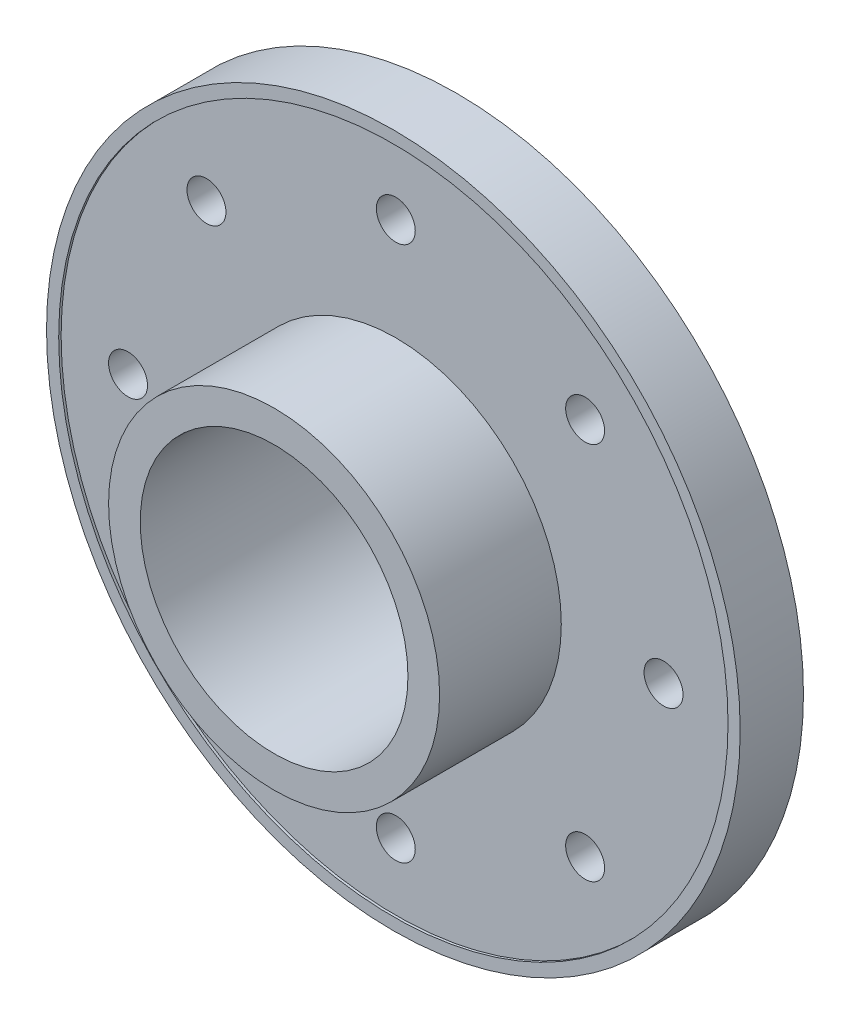
ISO-10303-21;
HEADER;
FILE_DESCRIPTION(('STEP AP214'),'2;1');
FILE_NAME('part.step','',(''),(''),'','','');
FILE_SCHEMA(('AUTOMOTIVE_DESIGN { 1 0 10303 214 1 1 1 1 }'));
ENDSEC;
DATA;
#1=APPLICATION_CONTEXT('core data for automotive mechanical design processes');
#2=APPLICATION_PROTOCOL_DEFINITION('international standard','automotive_design',2000,#1);
#3=PRODUCT_CONTEXT('',#1,'mechanical');
#4=PRODUCT('Part','Part','',(#3));
#5=PRODUCT_RELATED_PRODUCT_CATEGORY('part','',(#4));
#6=PRODUCT_DEFINITION_FORMATION('','',#4);
#7=PRODUCT_DEFINITION_CONTEXT('part definition',#1,'design');
#8=PRODUCT_DEFINITION('design','',#6,#7);
#9=PRODUCT_DEFINITION_SHAPE('','',#8);
#10=(LENGTH_UNIT() NAMED_UNIT(*) SI_UNIT(.MILLI.,.METRE.));
#11=(NAMED_UNIT(*) PLANE_ANGLE_UNIT() SI_UNIT($,.RADIAN.));
#12=(NAMED_UNIT(*) SI_UNIT($,.STERADIAN.) SOLID_ANGLE_UNIT());
#13=UNCERTAINTY_MEASURE_WITH_UNIT(LENGTH_MEASURE(1.E-05),#10,'distance_accuracy_value','');
#14=(GEOMETRIC_REPRESENTATION_CONTEXT(3) GLOBAL_UNCERTAINTY_ASSIGNED_CONTEXT((#13)) GLOBAL_UNIT_ASSIGNED_CONTEXT((#10,
#11,#12)) REPRESENTATION_CONTEXT('',''));
#15=CARTESIAN_POINT('',(0.,0.,0.));
#16=DIRECTION('',(0.,0.,1.));
#17=DIRECTION('',(1.,0.,0.));
#18=AXIS2_PLACEMENT_3D('',#15,#16,#17);
#19=CARTESIAN_POINT('',(0.,0.,3.));
#20=DIRECTION('',(0.,0.,1.));
#21=DIRECTION('',(1.,0.,0.));
#22=AXIS2_PLACEMENT_3D('',#19,#20,#21);
#23=PLANE('',#22);
#24=CARTESIAN_POINT('',(15.556349186104,15.556349186104,3.));
#25=DIRECTION('',(0.,0.,1.));
#26=DIRECTION('',(1.,0.,0.));
#27=AXIS2_PLACEMENT_3D('',#24,#25,#26);
#28=CIRCLE('',#27,1.6);
#29=CARTESIAN_POINT('',(17.156349186104,15.556349186104,3.));
#30=VERTEX_POINT('',#29);
#31=EDGE_CURVE('E265',#30,#30,#28,.F.);
#32=ORIENTED_EDGE('',*,*,#31,.T.);
#33=EDGE_LOOP('',(#32));
#34=FACE_BOUND('',#33,.T.);
#35=CARTESIAN_POINT('',(22.,0.,3.));
#36=DIRECTION('',(0.,0.,1.));
#37=DIRECTION('',(1.,0.,0.));
#38=AXIS2_PLACEMENT_3D('',#35,#36,#37);
#39=CIRCLE('',#38,1.6);
#40=CARTESIAN_POINT('',(23.6,0.,3.));
#41=VERTEX_POINT('',#40);
#42=EDGE_CURVE('E261',#41,#41,#39,.F.);
#43=ORIENTED_EDGE('',*,*,#42,.T.);
#44=EDGE_LOOP('',(#43));
#45=FACE_BOUND('',#44,.T.);
#46=CARTESIAN_POINT('',(15.556349186104,-15.556349186104,3.));
#47=DIRECTION('',(0.,0.,1.));
#48=DIRECTION('',(1.,0.,0.));
#49=AXIS2_PLACEMENT_3D('',#46,#47,#48);
#50=CIRCLE('',#49,1.6);
#51=CARTESIAN_POINT('',(17.156349186104,-15.556349186104,3.));
#52=VERTEX_POINT('',#51);
#53=EDGE_CURVE('E257',#52,#52,#50,.F.);
#54=ORIENTED_EDGE('',*,*,#53,.T.);
#55=EDGE_LOOP('',(#54));
#56=FACE_BOUND('',#55,.T.);
#57=CARTESIAN_POINT('',(0.,-22.,3.));
#58=DIRECTION('',(0.,0.,1.));
#59=DIRECTION('',(1.,0.,0.));
#60=AXIS2_PLACEMENT_3D('',#57,#58,#59);
#61=CIRCLE('',#60,1.6);
#62=CARTESIAN_POINT('',(1.6,-22.,3.));
#63=VERTEX_POINT('',#62);
#64=EDGE_CURVE('E253',#63,#63,#61,.F.);
#65=ORIENTED_EDGE('',*,*,#64,.T.);
#66=EDGE_LOOP('',(#65));
#67=FACE_BOUND('',#66,.T.);
#68=CARTESIAN_POINT('',(-15.556349186104,-15.556349186104,3.));
#69=DIRECTION('',(0.,0.,1.));
#70=DIRECTION('',(1.,0.,0.));
#71=AXIS2_PLACEMENT_3D('',#68,#69,#70);
#72=CIRCLE('',#71,1.6);
#73=CARTESIAN_POINT('',(-13.956349186104,-15.556349186104,3.));
#74=VERTEX_POINT('',#73);
#75=EDGE_CURVE('E249',#74,#74,#72,.F.);
#76=ORIENTED_EDGE('',*,*,#75,.T.);
#77=EDGE_LOOP('',(#76));
#78=FACE_BOUND('',#77,.T.);
#79=CARTESIAN_POINT('',(-22.,0.,3.));
#80=DIRECTION('',(0.,0.,1.));
#81=DIRECTION('',(1.,0.,0.));
#82=AXIS2_PLACEMENT_3D('',#79,#80,#81);
#83=CIRCLE('',#82,1.6);
#84=CARTESIAN_POINT('',(-20.4,0.,3.));
#85=VERTEX_POINT('',#84);
#86=EDGE_CURVE('E245',#85,#85,#83,.F.);
#87=ORIENTED_EDGE('',*,*,#86,.T.);
#88=EDGE_LOOP('',(#87));
#89=FACE_BOUND('',#88,.T.);
#90=CARTESIAN_POINT('',(-15.556349186104,15.556349186104,3.));
#91=DIRECTION('',(0.,0.,1.));
#92=DIRECTION('',(1.,0.,0.));
#93=AXIS2_PLACEMENT_3D('',#90,#91,#92);
#94=CIRCLE('',#93,1.6);
#95=CARTESIAN_POINT('',(-13.956349186104,15.556349186104,3.));
#96=VERTEX_POINT('',#95);
#97=EDGE_CURVE('E213',#96,#96,#94,.F.);
#98=ORIENTED_EDGE('',*,*,#97,.T.);
#99=EDGE_LOOP('',(#98));
#100=FACE_BOUND('',#99,.T.);
#101=CARTESIAN_POINT('',(0.,22.,3.));
#102=DIRECTION('',(0.,0.,1.));
#103=DIRECTION('',(1.,0.,0.));
#104=AXIS2_PLACEMENT_3D('',#101,#102,#103);
#105=CIRCLE('',#104,1.6);
#106=CARTESIAN_POINT('',(1.6,22.,3.));
#107=VERTEX_POINT('',#106);
#108=EDGE_CURVE('E210',#107,#107,#105,.F.);
#109=ORIENTED_EDGE('',*,*,#108,.T.);
#110=EDGE_LOOP('',(#109));
#111=FACE_BOUND('',#110,.T.);
#112=CARTESIAN_POINT('',(0.,0.,3.));
#113=DIRECTION('',(0.,0.,1.));
#114=DIRECTION('',(1.,0.,0.));
#115=AXIS2_PLACEMENT_3D('',#112,#113,#114);
#116=CIRCLE('',#115,13.6);
#117=CARTESIAN_POINT('',(13.6,0.,3.));
#118=VERTEX_POINT('',#117);
#119=EDGE_CURVE('E214',#118,#118,#116,.T.);
#120=ORIENTED_EDGE('',*,*,#119,.F.);
#121=EDGE_LOOP('',(#120));
#122=FACE_BOUND('',#121,.T.);
#123=CARTESIAN_POINT('',(0.,0.,3.));
#124=DIRECTION('',(0.,0.,1.));
#125=DIRECTION('',(1.,0.,0.));
#126=AXIS2_PLACEMENT_3D('',#123,#124,#125);
#127=CIRCLE('',#126,27.5);
#128=CARTESIAN_POINT('',(27.5,0.,3.));
#129=VERTEX_POINT('',#128);
#130=EDGE_CURVE('E12',#129,#129,#127,.F.);
#131=ORIENTED_EDGE('',*,*,#130,.F.);
#132=EDGE_LOOP('',(#131));
#133=FACE_BOUND('',#132,.T.);
#134=ADVANCED_FACE('F118',(#34,#45,#56,#67,#78,#89,#100,#111,#122,#133),#23,.T.);
#135=CARTESIAN_POINT('',(0.,0.,4.));
#136=DIRECTION('',(0.,0.,-1.));
#137=DIRECTION('',(-1.,0.,0.));
#138=AXIS2_PLACEMENT_3D('',#135,#136,#137);
#139=CYLINDRICAL_SURFACE('',#138,27.5);
#140=CARTESIAN_POINT('',(0.,0.,-2.));
#141=DIRECTION('',(0.,0.,1.));
#142=DIRECTION('',(1.,0.,0.));
#143=AXIS2_PLACEMENT_3D('',#140,#141,#142);
#144=CIRCLE('',#143,27.5);
#145=CARTESIAN_POINT('',(-24.1153846153846,13.2173456053805,-2.));
#146=VERTEX_POINT('',#145);
#147=CARTESIAN_POINT('',(-24.1153846153846,-13.2173456053805,-2.));
#148=VERTEX_POINT('',#147);
#149=EDGE_CURVE('E166',#146,#148,#144,.T.);
#150=ORIENTED_EDGE('',*,*,#149,.F.);
#151=DIRECTION('',(0.,0.,1.));
#152=VECTOR('',#151,1.);
#153=CARTESIAN_POINT('',(-24.1153846153846,13.2173456053805,-10.));
#154=LINE('',#153,#152);
#155=CARTESIAN_POINT('',(-24.1153846153846,13.2173456053805,-2.5));
#156=VERTEX_POINT('',#155);
#157=EDGE_CURVE('E170',#156,#146,#154,.T.);
#158=ORIENTED_EDGE('',*,*,#157,.F.);
#159=CARTESIAN_POINT('',(0.,0.,-9.99999999999999));
#160=DIRECTION('',(0.,-0.493519081729344,0.869734968808904));
#161=DIRECTION('',(0.,-0.869734968808904,-0.493519081729344));
#162=AXIS2_PLACEMENT_3D('',#159,#160,#161);
#163=ELLIPSE('',#162,31.6188275580791,27.5);
#164=CARTESIAN_POINT('',(-27.5,0.,-10.));
#165=VERTEX_POINT('',#164);
#166=EDGE_CURVE('E191',#156,#165,#163,.T.);
#167=ORIENTED_EDGE('',*,*,#166,.T.);
#168=CARTESIAN_POINT('',(0.,0.,-10.));
#169=DIRECTION('',(0.,0.493519081729344,0.869734968808904));
#170=DIRECTION('',(0.,0.869734968808904,-0.493519081729344));
#171=AXIS2_PLACEMENT_3D('',#168,#169,#170);
#172=ELLIPSE('',#171,31.6188275580791,27.5);
#173=CARTESIAN_POINT('',(-24.1153846153846,-13.2173456053805,-2.5));
#174=VERTEX_POINT('',#173);
#175=EDGE_CURVE('E141',#165,#174,#172,.T.);
#176=ORIENTED_EDGE('',*,*,#175,.T.);
#177=DIRECTION('',(0.,0.,1.));
#178=VECTOR('',#177,1.);
#179=CARTESIAN_POINT('',(-24.1153846153846,-13.2173456053805,-10.));
#180=LINE('',#179,#178);
#181=EDGE_CURVE('E172',#174,#148,#180,.T.);
#182=ORIENTED_EDGE('',*,*,#181,.T.);
#183=EDGE_LOOP('',(#150,#158,#167,#176,#182));
#184=FACE_BOUND('',#183,.T.);
#185=ADVANCED_FACE('F120',(#184),#139,.T.);
#186=CARTESIAN_POINT('',(0.,0.,24.));
#187=DIRECTION('',(0.,0.,-1.));
#188=DIRECTION('',(-1.,0.,0.));
#189=AXIS2_PLACEMENT_3D('',#186,#187,#188);
#190=CYLINDRICAL_SURFACE('',#189,13.6);
#191=ORIENTED_EDGE('',*,*,#119,.T.);
#192=EDGE_LOOP('',(#191));
#193=FACE_BOUND('',#192,.T.);
#194=CARTESIAN_POINT('',(0.,0.,13.));
#195=DIRECTION('',(0.,0.,1.));
#196=DIRECTION('',(1.,0.,0.));
#197=AXIS2_PLACEMENT_3D('',#194,#195,#196);
#198=CIRCLE('',#197,13.6);
#199=CARTESIAN_POINT('',(13.6,0.,13.));
#200=VERTEX_POINT('',#199);
#201=EDGE_CURVE('E232',#200,#200,#198,.T.);
#202=ORIENTED_EDGE('',*,*,#201,.F.);
#203=EDGE_LOOP('',(#202));
#204=FACE_BOUND('',#203,.T.);
#205=ADVANCED_FACE('F344',(#193,#204),#190,.T.);
#206=CARTESIAN_POINT('',(0.,0.,24.));
#207=DIRECTION('',(0.,0.,-1.));
#208=DIRECTION('',(-1.,0.,0.));
#209=AXIS2_PLACEMENT_3D('',#206,#207,#208);
#210=CYLINDRICAL_SURFACE('',#209,11.);
#211=CARTESIAN_POINT('',(0.,0.,13.));
#212=DIRECTION('',(0.,0.,1.));
#213=DIRECTION('',(1.,0.,0.));
#214=AXIS2_PLACEMENT_3D('',#211,#212,#213);
#215=CIRCLE('',#214,11.);
#216=CARTESIAN_POINT('',(11.,0.,13.));
#217=VERTEX_POINT('',#216);
#218=EDGE_CURVE('E229',#217,#217,#215,.T.);
#219=ORIENTED_EDGE('',*,*,#218,.T.);
#220=EDGE_LOOP('',(#219));
#221=FACE_BOUND('',#220,.T.);
#222=CARTESIAN_POINT('',(0.,0.,-10.));
#223=DIRECTION('',(0.,0.,1.));
#224=DIRECTION('',(1.,0.,0.));
#225=AXIS2_PLACEMENT_3D('',#222,#223,#224);
#226=CIRCLE('',#225,11.);
#227=CARTESIAN_POINT('',(11.,0.,-10.));
#228=VERTEX_POINT('',#227);
#229=EDGE_CURVE('E187',#228,#228,#226,.F.);
#230=ORIENTED_EDGE('',*,*,#229,.T.);
#231=EDGE_LOOP('',(#230));
#232=FACE_BOUND('',#231,.T.);
#233=ADVANCED_FACE('F390',(#221,#232),#210,.F.);
#234=CARTESIAN_POINT('',(15.556349186104,15.556349186104,4.));
#235=DIRECTION('',(0.,0.,-1.));
#236=DIRECTION('',(-1.,0.,0.));
#237=AXIS2_PLACEMENT_3D('',#234,#235,#236);
#238=CYLINDRICAL_SURFACE('',#237,1.6);
#239=ORIENTED_EDGE('',*,*,#31,.F.);
#240=EDGE_LOOP('',(#239));
#241=FACE_BOUND('',#240,.T.);
#242=CARTESIAN_POINT('',(15.556349186104,15.556349186104,-2.));
#243=DIRECTION('',(0.,0.,-1.));
#244=DIRECTION('',(-1.,0.,0.));
#245=AXIS2_PLACEMENT_3D('',#242,#243,#244);
#246=CIRCLE('',#245,1.6);
#247=CARTESIAN_POINT('',(13.956349186104,15.556349186104,-2.));
#248=VERTEX_POINT('',#247);
#249=EDGE_CURVE('E292',#248,#248,#246,.T.);
#250=ORIENTED_EDGE('',*,*,#249,.T.);
#251=EDGE_LOOP('',(#250));
#252=FACE_BOUND('',#251,.T.);
#253=ADVANCED_FACE('F386',(#241,#252),#238,.F.);
#254=CARTESIAN_POINT('',(22.,0.,4.));
#255=DIRECTION('',(0.,0.,-1.));
#256=DIRECTION('',(-1.,0.,0.));
#257=AXIS2_PLACEMENT_3D('',#254,#255,#256);
#258=CYLINDRICAL_SURFACE('',#257,1.6);
#259=ORIENTED_EDGE('',*,*,#42,.F.);
#260=EDGE_LOOP('',(#259));
#261=FACE_BOUND('',#260,.T.);
#262=CARTESIAN_POINT('',(22.,0.,-2.));
#263=DIRECTION('',(0.,0.,-1.));
#264=DIRECTION('',(-1.,0.,0.));
#265=AXIS2_PLACEMENT_3D('',#262,#263,#264);
#266=CIRCLE('',#265,1.6);
#267=CARTESIAN_POINT('',(20.4,0.,-2.));
#268=VERTEX_POINT('',#267);
#269=EDGE_CURVE('E297',#268,#268,#266,.T.);
#270=ORIENTED_EDGE('',*,*,#269,.T.);
#271=EDGE_LOOP('',(#270));
#272=FACE_BOUND('',#271,.T.);
#273=ADVANCED_FACE('F382',(#261,#272),#258,.F.);
#274=CARTESIAN_POINT('',(15.556349186104,-15.556349186104,4.));
#275=DIRECTION('',(0.,0.,-1.));
#276=DIRECTION('',(-1.,0.,0.));
#277=AXIS2_PLACEMENT_3D('',#274,#275,#276);
#278=CYLINDRICAL_SURFACE('',#277,1.6);
#279=ORIENTED_EDGE('',*,*,#53,.F.);
#280=EDGE_LOOP('',(#279));
#281=FACE_BOUND('',#280,.T.);
#282=CARTESIAN_POINT('',(15.556349186104,-15.556349186104,-2.));
#283=DIRECTION('',(0.,0.,-1.));
#284=DIRECTION('',(-1.,0.,0.));
#285=AXIS2_PLACEMENT_3D('',#282,#283,#284);
#286=CIRCLE('',#285,1.6);
#287=CARTESIAN_POINT('',(13.956349186104,-15.556349186104,-2.));
#288=VERTEX_POINT('',#287);
#289=EDGE_CURVE('E300',#288,#288,#286,.T.);
#290=ORIENTED_EDGE('',*,*,#289,.T.);
#291=EDGE_LOOP('',(#290));
#292=FACE_BOUND('',#291,.T.);
#293=ADVANCED_FACE('F378',(#281,#292),#278,.F.);
#294=CARTESIAN_POINT('',(0.,-22.,4.));
#295=DIRECTION('',(0.,0.,-1.));
#296=DIRECTION('',(-1.,0.,0.));
#297=AXIS2_PLACEMENT_3D('',#294,#295,#296);
#298=CYLINDRICAL_SURFACE('',#297,1.6);
#299=ORIENTED_EDGE('',*,*,#64,.F.);
#300=EDGE_LOOP('',(#299));
#301=FACE_BOUND('',#300,.T.);
#302=CARTESIAN_POINT('',(0.,-22.,-2.));
#303=DIRECTION('',(0.,0.,-1.));
#304=DIRECTION('',(-1.,0.,0.));
#305=AXIS2_PLACEMENT_3D('',#302,#303,#304);
#306=CIRCLE('',#305,1.6);
#307=CARTESIAN_POINT('',(-1.6,-22.,-2.));
#308=VERTEX_POINT('',#307);
#309=EDGE_CURVE('E303',#308,#308,#306,.T.);
#310=ORIENTED_EDGE('',*,*,#309,.T.);
#311=EDGE_LOOP('',(#310));
#312=FACE_BOUND('',#311,.T.);
#313=ADVANCED_FACE('F374',(#301,#312),#298,.F.);
#314=CARTESIAN_POINT('',(-15.556349186104,-15.556349186104,4.));
#315=DIRECTION('',(0.,0.,-1.));
#316=DIRECTION('',(-1.,0.,0.));
#317=AXIS2_PLACEMENT_3D('',#314,#315,#316);
#318=CYLINDRICAL_SURFACE('',#317,1.6);
#319=ORIENTED_EDGE('',*,*,#75,.F.);
#320=EDGE_LOOP('',(#319));
#321=FACE_BOUND('',#320,.T.);
#322=CARTESIAN_POINT('',(-15.556349186104,-15.556349186104,-2.));
#323=DIRECTION('',(0.,0.,-1.));
#324=DIRECTION('',(-1.,0.,0.));
#325=AXIS2_PLACEMENT_3D('',#322,#323,#324);
#326=CIRCLE('',#325,1.6);
#327=CARTESIAN_POINT('',(-17.156349186104,-15.556349186104,-2.));
#328=VERTEX_POINT('',#327);
#329=EDGE_CURVE('E306',#328,#328,#326,.T.);
#330=ORIENTED_EDGE('',*,*,#329,.T.);
#331=EDGE_LOOP('',(#330));
#332=FACE_BOUND('',#331,.T.);
#333=ADVANCED_FACE('F370',(#321,#332),#318,.F.);
#334=CARTESIAN_POINT('',(-22.,0.,4.));
#335=DIRECTION('',(0.,0.,-1.));
#336=DIRECTION('',(-1.,0.,0.));
#337=AXIS2_PLACEMENT_3D('',#334,#335,#336);
#338=CYLINDRICAL_SURFACE('',#337,1.6);
#339=ORIENTED_EDGE('',*,*,#86,.F.);
#340=EDGE_LOOP('',(#339));
#341=FACE_BOUND('',#340,.T.);
#342=CARTESIAN_POINT('',(-22.,0.,-2.));
#343=DIRECTION('',(0.,0.,-1.));
#344=DIRECTION('',(-1.,0.,0.));
#345=AXIS2_PLACEMENT_3D('',#342,#343,#344);
#346=CIRCLE('',#345,1.6);
#347=CARTESIAN_POINT('',(-23.6,0.,-2.));
#348=VERTEX_POINT('',#347);
#349=EDGE_CURVE('E309',#348,#348,#346,.T.);
#350=ORIENTED_EDGE('',*,*,#349,.T.);
#351=EDGE_LOOP('',(#350));
#352=FACE_BOUND('',#351,.T.);
#353=ADVANCED_FACE('F366',(#341,#352),#338,.F.);
#354=CARTESIAN_POINT('',(-15.556349186104,15.556349186104,4.));
#355=DIRECTION('',(0.,0.,-1.));
#356=DIRECTION('',(-1.,0.,0.));
#357=AXIS2_PLACEMENT_3D('',#354,#355,#356);
#358=CYLINDRICAL_SURFACE('',#357,1.6);
#359=ORIENTED_EDGE('',*,*,#97,.F.);
#360=EDGE_LOOP('',(#359));
#361=FACE_BOUND('',#360,.T.);
#362=CARTESIAN_POINT('',(-15.556349186104,15.556349186104,-2.));
#363=DIRECTION('',(0.,0.,-1.));
#364=DIRECTION('',(-1.,0.,0.));
#365=AXIS2_PLACEMENT_3D('',#362,#363,#364);
#366=CIRCLE('',#365,1.6);
#367=CARTESIAN_POINT('',(-17.156349186104,15.556349186104,-2.));
#368=VERTEX_POINT('',#367);
#369=EDGE_CURVE('E312',#368,#368,#366,.T.);
#370=ORIENTED_EDGE('',*,*,#369,.T.);
#371=EDGE_LOOP('',(#370));
#372=FACE_BOUND('',#371,.T.);
#373=ADVANCED_FACE('F362',(#361,#372),#358,.F.);
#374=CARTESIAN_POINT('',(0.,22.,4.));
#375=DIRECTION('',(0.,0.,-1.));
#376=DIRECTION('',(-1.,0.,0.));
#377=AXIS2_PLACEMENT_3D('',#374,#375,#376);
#378=CYLINDRICAL_SURFACE('',#377,1.6);
#379=ORIENTED_EDGE('',*,*,#108,.F.);
#380=EDGE_LOOP('',(#379));
#381=FACE_BOUND('',#380,.T.);
#382=CARTESIAN_POINT('',(0.,22.,-2.));
#383=DIRECTION('',(0.,0.,-1.));
#384=DIRECTION('',(-1.,0.,0.));
#385=AXIS2_PLACEMENT_3D('',#382,#383,#384);
#386=CIRCLE('',#385,1.6);
#387=CARTESIAN_POINT('',(-1.6,22.,-2.));
#388=VERTEX_POINT('',#387);
#389=EDGE_CURVE('E288',#388,#388,#386,.T.);
#390=ORIENTED_EDGE('',*,*,#389,.T.);
#391=EDGE_LOOP('',(#390));
#392=FACE_BOUND('',#391,.T.);
#393=ADVANCED_FACE('F359',(#381,#392),#378,.F.);
#394=CARTESIAN_POINT('',(0.,0.,-10.));
#395=DIRECTION('',(0.480630749286565,0.876923076923076,0.));
#396=DIRECTION('',(-0.876923076923076,0.480630749286565,0.));
#397=AXIS2_PLACEMENT_3D('',#394,#395,#396);
#398=PLANE('',#397);
#399=DIRECTION('',(-0.876923076923076,0.480630749286565,0.));
#400=VECTOR('',#399,1.);
#401=CARTESIAN_POINT('',(0.,0.,-2.));
#402=LINE('',#401,#400);
#403=CARTESIAN_POINT('',(-22.8,12.4963994814507,-2.));
#404=VERTEX_POINT('',#403);
#405=EDGE_CURVE('E179',#404,#146,#402,.T.);
#406=ORIENTED_EDGE('',*,*,#405,.F.);
#407=DIRECTION('',(0.,0.,1.));
#408=VECTOR('',#407,1.);
#409=CARTESIAN_POINT('',(-22.8,12.4963994814507,-10.));
#410=LINE('',#409,#408);
#411=CARTESIAN_POINT('',(-22.8,12.4963994814507,-2.9090909090909));
#412=VERTEX_POINT('',#411);
#413=EDGE_CURVE('E204',#412,#404,#410,.T.);
#414=ORIENTED_EDGE('',*,*,#413,.F.);
#415=DIRECTION('',(0.846023658623857,-0.463695158286061,-0.263117405792109));
#416=VECTOR('',#415,1.);
#417=CARTESIAN_POINT('',(0.,0.,-10.));
#418=LINE('',#417,#416);
#419=EDGE_CURVE('E133',#156,#412,#418,.T.);
#420=ORIENTED_EDGE('',*,*,#419,.F.);
#421=ORIENTED_EDGE('',*,*,#157,.T.);
#422=EDGE_LOOP('',(#406,#414,#420,#421));
#423=FACE_BOUND('',#422,.T.);
#424=ADVANCED_FACE('F189',(#423),#398,.T.);
#425=CARTESIAN_POINT('',(0.,0.,-10.));
#426=DIRECTION('',(0.,0.,1.));
#427=DIRECTION('',(1.,0.,0.));
#428=AXIS2_PLACEMENT_3D('',#425,#426,#427);
#429=CYLINDRICAL_SURFACE('',#428,26.);
#430=ORIENTED_EDGE('',*,*,#413,.T.);
#431=CARTESIAN_POINT('',(0.,0.,-2.));
#432=DIRECTION('',(0.,0.,-1.));
#433=DIRECTION('',(-1.,0.,0.));
#434=AXIS2_PLACEMENT_3D('',#431,#432,#433);
#435=CIRCLE('',#434,26.);
#436=CARTESIAN_POINT('',(-22.8,-12.4963994814507,-2.));
#437=VERTEX_POINT('',#436);
#438=EDGE_CURVE('E183',#404,#437,#435,.F.);
#439=ORIENTED_EDGE('',*,*,#438,.T.);
#440=DIRECTION('',(0.,0.,1.));
#441=VECTOR('',#440,1.);
#442=CARTESIAN_POINT('',(-22.8,-12.4963994814507,-10.));
#443=LINE('',#442,#441);
#444=CARTESIAN_POINT('',(-22.8,-12.4963994814507,-2.90909090909091));
#445=VERTEX_POINT('',#444);
#446=EDGE_CURVE('E196',#445,#437,#443,.T.);
#447=ORIENTED_EDGE('',*,*,#446,.F.);
#448=CARTESIAN_POINT('',(0.,0.,-10.));
#449=DIRECTION('',(0.,0.493519081729344,0.869734968808904));
#450=DIRECTION('',(0.,-0.869734968808904,0.493519081729344));
#451=AXIS2_PLACEMENT_3D('',#448,#449,#450);
#452=ELLIPSE('',#451,29.8941642367293,26.);
#453=CARTESIAN_POINT('',(-26.,0.,-10.));
#454=VERTEX_POINT('',#453);
#455=EDGE_CURVE('E272',#445,#454,#452,.F.);
#456=ORIENTED_EDGE('',*,*,#455,.T.);
#457=CARTESIAN_POINT('',(0.,0.,-10.));
#458=DIRECTION('',(0.,-0.493519081729344,0.869734968808904));
#459=DIRECTION('',(0.,0.869734968808904,0.493519081729344));
#460=AXIS2_PLACEMENT_3D('',#457,#458,#459);
#461=ELLIPSE('',#460,29.8941642367293,26.);
#462=EDGE_CURVE('E278',#454,#412,#461,.F.);
#463=ORIENTED_EDGE('',*,*,#462,.T.);
#464=EDGE_LOOP('',(#430,#439,#447,#456,#463));
#465=FACE_BOUND('',#464,.T.);
#466=ADVANCED_FACE('F282',(#465),#429,.F.);
#467=CARTESIAN_POINT('',(0.,0.,-10.));
#468=DIRECTION('',(-0.480630749286565,0.876923076923076,0.));
#469=DIRECTION('',(-0.876923076923076,-0.480630749286565,0.));
#470=AXIS2_PLACEMENT_3D('',#467,#468,#469);
#471=PLANE('',#470);
#472=ORIENTED_EDGE('',*,*,#446,.T.);
#473=DIRECTION('',(-0.876923076923076,-0.480630749286565,0.));
#474=VECTOR('',#473,1.);
#475=CARTESIAN_POINT('',(0.,0.,-2.));
#476=LINE('',#475,#474);
#477=EDGE_CURVE('E287',#437,#148,#476,.T.);
#478=ORIENTED_EDGE('',*,*,#477,.T.);
#479=ORIENTED_EDGE('',*,*,#181,.F.);
#480=DIRECTION('',(0.846023658623857,0.463695158286061,-0.263117405792109));
#481=VECTOR('',#480,1.);
#482=CARTESIAN_POINT('',(0.,0.,-10.));
#483=LINE('',#482,#481);
#484=EDGE_CURVE('E269',#174,#445,#483,.T.);
#485=ORIENTED_EDGE('',*,*,#484,.T.);
#486=EDGE_LOOP('',(#472,#478,#479,#485));
#487=FACE_BOUND('',#486,.T.);
#488=ADVANCED_FACE('F286',(#487),#471,.F.);
#489=CARTESIAN_POINT('',(-50.,4.2923080315447,-7.56438915969025));
#490=DIRECTION('',(0.,-0.493519081729344,0.869734968808904));
#491=DIRECTION('',(0.,-0.869734968808904,-0.493519081729344));
#492=AXIS2_PLACEMENT_3D('',#489,#490,#491);
#493=PLANE('',#492);
#494=ORIENTED_EDGE('',*,*,#419,.T.);
#495=ORIENTED_EDGE('',*,*,#462,.F.);
#496=DIRECTION('',(-1.,0.,0.));
#497=VECTOR('',#496,1.);
#498=CARTESIAN_POINT('',(0.,0.,-10.));
#499=LINE('',#498,#497);
#500=EDGE_CURVE('E207',#454,#165,#499,.T.);
#501=ORIENTED_EDGE('',*,*,#500,.T.);
#502=ORIENTED_EDGE('',*,*,#166,.F.);
#503=EDGE_LOOP('',(#494,#495,#501,#502));
#504=FACE_BOUND('',#503,.T.);
#505=ADVANCED_FACE('F284',(#504),#493,.F.);
#506=CARTESIAN_POINT('',(-50.,-4.2923080315447,-7.56438915969025));
#507=DIRECTION('',(0.,0.493519081729344,0.869734968808904));
#508=DIRECTION('',(0.,-0.869734968808904,0.493519081729344));
#509=AXIS2_PLACEMENT_3D('',#506,#507,#508);
#510=PLANE('',#509);
#511=ORIENTED_EDGE('',*,*,#500,.F.);
#512=ORIENTED_EDGE('',*,*,#455,.F.);
#513=ORIENTED_EDGE('',*,*,#484,.F.);
#514=ORIENTED_EDGE('',*,*,#175,.F.);
#515=EDGE_LOOP('',(#511,#512,#513,#514));
#516=FACE_BOUND('',#515,.T.);
#517=ADVANCED_FACE('F348',(#516),#510,.F.);
#518=CARTESIAN_POINT('',(0.,0.,13.));
#519=DIRECTION('',(0.,0.,1.));
#520=DIRECTION('',(1.,0.,0.));
#521=AXIS2_PLACEMENT_3D('',#518,#519,#520);
#522=PLANE('',#521);
#523=ORIENTED_EDGE('',*,*,#218,.F.);
#524=EDGE_LOOP('',(#523));
#525=FACE_BOUND('',#524,.T.);
#526=ORIENTED_EDGE('',*,*,#201,.T.);
#527=EDGE_LOOP('',(#526));
#528=FACE_BOUND('',#527,.T.);
#529=ADVANCED_FACE('F223',(#525,#528),#522,.T.);
#530=CARTESIAN_POINT('',(0.,0.,-10.));
#531=DIRECTION('',(0.,0.,1.));
#532=DIRECTION('',(1.,0.,0.));
#533=AXIS2_PLACEMENT_3D('',#530,#531,#532);
#534=CYLINDRICAL_SURFACE('',#533,13.6);
#535=CARTESIAN_POINT('',(0.,0.,-2.));
#536=DIRECTION('',(0.,0.,-1.));
#537=DIRECTION('',(-1.,0.,0.));
#538=AXIS2_PLACEMENT_3D('',#535,#536,#537);
#539=CIRCLE('',#538,13.6);
#540=CARTESIAN_POINT('',(-13.6,0.,-2.));
#541=VERTEX_POINT('',#540);
#542=EDGE_CURVE('E126',#541,#541,#539,.F.);
#543=ORIENTED_EDGE('',*,*,#542,.F.);
#544=EDGE_LOOP('',(#543));
#545=FACE_BOUND('',#544,.T.);
#546=CARTESIAN_POINT('',(0.,0.,-10.));
#547=DIRECTION('',(0.,0.,1.));
#548=DIRECTION('',(1.,0.,0.));
#549=AXIS2_PLACEMENT_3D('',#546,#547,#548);
#550=CIRCLE('',#549,13.6);
#551=CARTESIAN_POINT('',(13.6,0.,-10.));
#552=VERTEX_POINT('',#551);
#553=EDGE_CURVE('E227',#552,#552,#550,.T.);
#554=ORIENTED_EDGE('',*,*,#553,.T.);
#555=EDGE_LOOP('',(#554));
#556=FACE_BOUND('',#555,.T.);
#557=ADVANCED_FACE('F219',(#545,#556),#534,.T.);
#558=CARTESIAN_POINT('',(0.,0.,-10.));
#559=DIRECTION('',(0.,0.,1.));
#560=DIRECTION('',(1.,0.,0.));
#561=AXIS2_PLACEMENT_3D('',#558,#559,#560);
#562=PLANE('',#561);
#563=ORIENTED_EDGE('',*,*,#553,.F.);
#564=EDGE_LOOP('',(#563));
#565=FACE_BOUND('',#564,.T.);
#566=ORIENTED_EDGE('',*,*,#229,.F.);
#567=EDGE_LOOP('',(#566));
#568=FACE_BOUND('',#567,.T.);
#569=ADVANCED_FACE('F222',(#565,#568),#562,.F.);
#570=CARTESIAN_POINT('',(0.,0.,-2.));
#571=DIRECTION('',(0.,0.,-1.));
#572=DIRECTION('',(-1.,0.,0.));
#573=AXIS2_PLACEMENT_3D('',#570,#571,#572);
#574=PLANE('',#573);
#575=ORIENTED_EDGE('',*,*,#349,.F.);
#576=EDGE_LOOP('',(#575));
#577=FACE_BOUND('',#576,.T.);
#578=ORIENTED_EDGE('',*,*,#309,.F.);
#579=EDGE_LOOP('',(#578));
#580=FACE_BOUND('',#579,.T.);
#581=ORIENTED_EDGE('',*,*,#269,.F.);
#582=EDGE_LOOP('',(#581));
#583=FACE_BOUND('',#582,.T.);
#584=ORIENTED_EDGE('',*,*,#389,.F.);
#585=EDGE_LOOP('',(#584));
#586=FACE_BOUND('',#585,.T.);
#587=ORIENTED_EDGE('',*,*,#438,.F.);
#588=ORIENTED_EDGE('',*,*,#405,.T.);
#589=ORIENTED_EDGE('',*,*,#149,.T.);
#590=ORIENTED_EDGE('',*,*,#477,.F.);
#591=EDGE_LOOP('',(#587,#588,#589,#590));
#592=FACE_BOUND('',#591,.T.);
#593=ORIENTED_EDGE('',*,*,#542,.T.);
#594=EDGE_LOOP('',(#593));
#595=FACE_BOUND('',#594,.T.);
#596=ORIENTED_EDGE('',*,*,#249,.F.);
#597=EDGE_LOOP('',(#596));
#598=FACE_BOUND('',#597,.T.);
#599=ORIENTED_EDGE('',*,*,#289,.F.);
#600=EDGE_LOOP('',(#599));
#601=FACE_BOUND('',#600,.T.);
#602=ORIENTED_EDGE('',*,*,#329,.F.);
#603=EDGE_LOOP('',(#602));
#604=FACE_BOUND('',#603,.T.);
#605=ORIENTED_EDGE('',*,*,#369,.F.);
#606=EDGE_LOOP('',(#605));
#607=FACE_BOUND('',#606,.T.);
#608=CARTESIAN_POINT('',(0.,0.,-2.));
#609=DIRECTION('',(0.,0.,1.));
#610=DIRECTION('',(1.,0.,0.));
#611=AXIS2_PLACEMENT_3D('',#608,#609,#610);
#612=CIRCLE('',#611,28.5);
#613=CARTESIAN_POINT('',(28.5,0.,-2.));
#614=VERTEX_POINT('',#613);
#615=EDGE_CURVE('E175',#614,#614,#612,.T.);
#616=ORIENTED_EDGE('',*,*,#615,.F.);
#617=EDGE_LOOP('',(#616));
#618=FACE_BOUND('',#617,.T.);
#619=ADVANCED_FACE('F180',(#577,#580,#583,#586,#592,#595,#598,#601,#604,#607,#618),#574,.T.);
#620=CARTESIAN_POINT('',(0.,0.,-2.));
#621=DIRECTION('',(0.,0.,1.));
#622=DIRECTION('',(1.,0.,0.));
#623=AXIS2_PLACEMENT_3D('',#620,#621,#622);
#624=CYLINDRICAL_SURFACE('',#623,28.5);
#625=ORIENTED_EDGE('',*,*,#615,.T.);
#626=EDGE_LOOP('',(#625));
#627=FACE_BOUND('',#626,.T.);
#628=CARTESIAN_POINT('',(0.,0.,3.2));
#629=DIRECTION('',(0.,0.,1.));
#630=DIRECTION('',(1.,0.,0.));
#631=AXIS2_PLACEMENT_3D('',#628,#629,#630);
#632=CIRCLE('',#631,28.5);
#633=CARTESIAN_POINT('',(28.5,0.,3.2));
#634=VERTEX_POINT('',#633);
#635=EDGE_CURVE('E319',#634,#634,#632,.T.);
#636=ORIENTED_EDGE('',*,*,#635,.F.);
#637=EDGE_LOOP('',(#636));
#638=FACE_BOUND('',#637,.T.);
#639=ADVANCED_FACE('F326',(#627,#638),#624,.T.);
#640=CARTESIAN_POINT('',(0.,0.,3.2));
#641=DIRECTION('',(0.,0.,1.));
#642=DIRECTION('',(1.,0.,0.));
#643=AXIS2_PLACEMENT_3D('',#640,#641,#642);
#644=PLANE('',#643);
#645=ORIENTED_EDGE('',*,*,#635,.T.);
#646=EDGE_LOOP('',(#645));
#647=FACE_BOUND('',#646,.T.);
#648=CARTESIAN_POINT('',(0.,0.,3.2));
#649=DIRECTION('',(0.,0.,1.));
#650=DIRECTION('',(1.,0.,0.));
#651=AXIS2_PLACEMENT_3D('',#648,#649,#650);
#652=CIRCLE('',#651,27.5);
#653=CARTESIAN_POINT('',(27.5,0.,3.2));
#654=VERTEX_POINT('',#653);
#655=EDGE_CURVE('E176',#654,#654,#652,.T.);
#656=ORIENTED_EDGE('',*,*,#655,.F.);
#657=EDGE_LOOP('',(#656));
#658=FACE_BOUND('',#657,.T.);
#659=ADVANCED_FACE('F323',(#647,#658),#644,.T.);
#660=CARTESIAN_POINT('',(0.,0.,3.2));
#661=DIRECTION('',(0.,0.,-1.));
#662=DIRECTION('',(-1.,0.,0.));
#663=AXIS2_PLACEMENT_3D('',#660,#661,#662);
#664=CYLINDRICAL_SURFACE('',#663,27.5);
#665=ORIENTED_EDGE('',*,*,#655,.T.);
#666=EDGE_LOOP('',(#665));
#667=FACE_BOUND('',#666,.T.);
#668=ORIENTED_EDGE('',*,*,#130,.T.);
#669=EDGE_LOOP('',(#668));
#670=FACE_BOUND('',#669,.T.);
#671=ADVANCED_FACE('F334',(#667,#670),#664,.F.);
#672=CLOSED_SHELL('',(#134,#185,#205,#233,#253,#273,#293,#313,#333,#353,#373,#393,#424,#466,
#488,#505,#517,#529,#557,#569,#619,#639,#659,#671));
#673=MANIFOLD_SOLID_BREP('B2',#672);
#674=ADVANCED_BREP_SHAPE_REPRESENTATION('',(#18,#673),#14);
#675=SHAPE_DEFINITION_REPRESENTATION(#9,#674);
ENDSEC;
END-ISO-10303-21;
